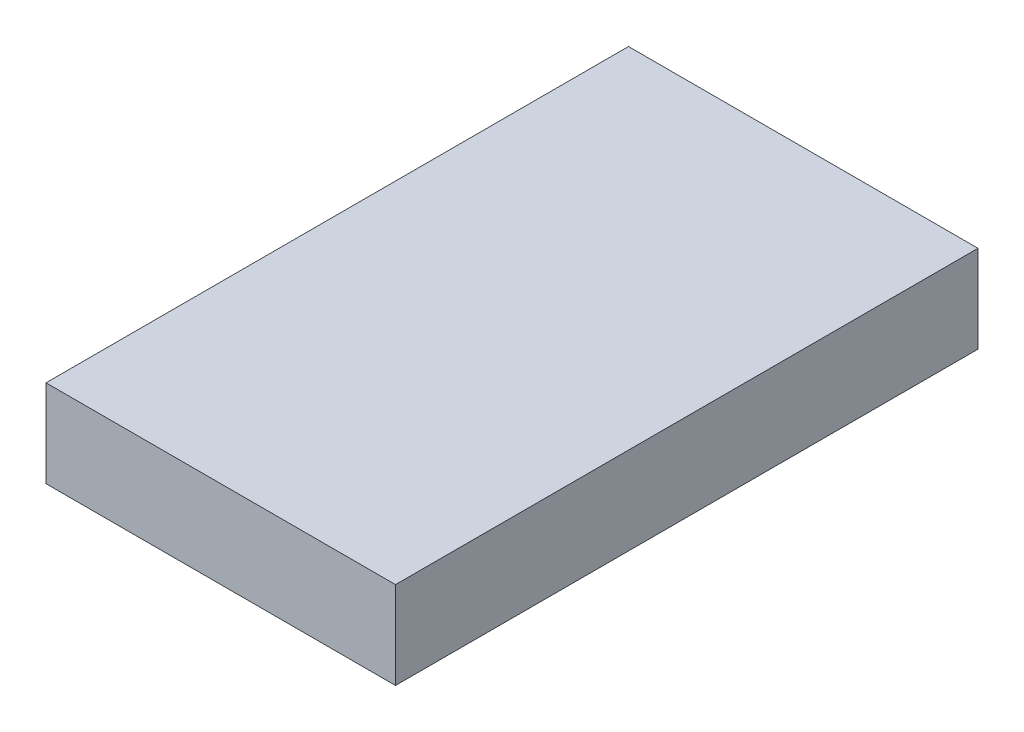
ISO-10303-21;
HEADER;
FILE_DESCRIPTION(('STEP AP214'),'2;1');
FILE_NAME('part.step','',(''),(''),'','','');
FILE_SCHEMA(('AUTOMOTIVE_DESIGN { 1 0 10303 214 1 1 1 1 }'));
ENDSEC;
DATA;
#1=APPLICATION_CONTEXT('core data for automotive mechanical design processes');
#2=APPLICATION_PROTOCOL_DEFINITION('international standard','automotive_design',2000,#1);
#3=PRODUCT_CONTEXT('',#1,'mechanical');
#4=PRODUCT('Part','Part','',(#3));
#5=PRODUCT_RELATED_PRODUCT_CATEGORY('part','',(#4));
#6=PRODUCT_DEFINITION_FORMATION('','',#4);
#7=PRODUCT_DEFINITION_CONTEXT('part definition',#1,'design');
#8=PRODUCT_DEFINITION('design','',#6,#7);
#9=PRODUCT_DEFINITION_SHAPE('','',#8);
#10=(LENGTH_UNIT() NAMED_UNIT(*) SI_UNIT(.MILLI.,.METRE.));
#11=(NAMED_UNIT(*) PLANE_ANGLE_UNIT() SI_UNIT($,.RADIAN.));
#12=(NAMED_UNIT(*) SI_UNIT($,.STERADIAN.) SOLID_ANGLE_UNIT());
#13=UNCERTAINTY_MEASURE_WITH_UNIT(LENGTH_MEASURE(1.E-05),#10,'distance_accuracy_value','');
#14=(GEOMETRIC_REPRESENTATION_CONTEXT(3) GLOBAL_UNCERTAINTY_ASSIGNED_CONTEXT((#13)) GLOBAL_UNIT_ASSIGNED_CONTEXT((#10,
#11,#12)) REPRESENTATION_CONTEXT('',''));
#15=CARTESIAN_POINT('',(0.,0.,0.));
#16=DIRECTION('',(0.,0.,1.));
#17=DIRECTION('',(1.,0.,0.));
#18=AXIS2_PLACEMENT_3D('',#15,#16,#17);
#19=CARTESIAN_POINT('',(-300.,0.,150.));
#20=DIRECTION('',(0.,0.,-1.));
#21=DIRECTION('',(0.,1.,0.));
#22=AXIS2_PLACEMENT_3D('',#19,#20,#21);
#23=PLANE('',#22);
#24=DIRECTION('',(1.,0.,0.));
#25=VECTOR('',#24,1.);
#26=CARTESIAN_POINT('',(-300.,150.,150.));
#27=LINE('',#26,#25);
#28=CARTESIAN_POINT('',(-300.,150.,150.));
#29=VERTEX_POINT('',#28);
#30=CARTESIAN_POINT('',(300.,150.,150.));
#31=VERTEX_POINT('',#30);
#32=EDGE_CURVE('E95',#29,#31,#27,.T.);
#33=ORIENTED_EDGE('',*,*,#32,.T.);
#34=DIRECTION('',(0.,1.,0.));
#35=VECTOR('',#34,1.);
#36=CARTESIAN_POINT('',(300.,0.,150.));
#37=LINE('',#36,#35);
#38=CARTESIAN_POINT('',(300.,0.,150.));
#39=VERTEX_POINT('',#38);
#40=EDGE_CURVE('E129',#39,#31,#37,.T.);
#41=ORIENTED_EDGE('',*,*,#40,.F.);
#42=DIRECTION('',(1.,0.,0.));
#43=VECTOR('',#42,1.);
#44=CARTESIAN_POINT('',(-300.,0.,150.));
#45=LINE('',#44,#43);
#46=CARTESIAN_POINT('',(-300.,0.,150.));
#47=VERTEX_POINT('',#46);
#48=EDGE_CURVE('E12',#47,#39,#45,.T.);
#49=ORIENTED_EDGE('',*,*,#48,.F.);
#50=DIRECTION('',(0.,1.,0.));
#51=VECTOR('',#50,1.);
#52=CARTESIAN_POINT('',(-300.,0.,150.));
#53=LINE('',#52,#51);
#54=EDGE_CURVE('E134',#47,#29,#53,.T.);
#55=ORIENTED_EDGE('',*,*,#54,.T.);
#56=EDGE_LOOP('',(#33,#41,#49,#55));
#57=FACE_BOUND('',#56,.T.);
#58=ADVANCED_FACE('F90',(#57),#23,.T.);
#59=CARTESIAN_POINT('',(-300.,0.,0.));
#60=DIRECTION('',(0.,1.,0.));
#61=DIRECTION('',(0.,0.,1.));
#62=AXIS2_PLACEMENT_3D('',#59,#60,#61);
#63=PLANE('',#62);
#64=ORIENTED_EDGE('',*,*,#48,.T.);
#65=DIRECTION('',(0.,0.,1.));
#66=VECTOR('',#65,1.);
#67=CARTESIAN_POINT('',(300.,0.,0.));
#68=LINE('',#67,#66);
#69=CARTESIAN_POINT('',(300.,0.,1150.));
#70=VERTEX_POINT('',#69);
#71=EDGE_CURVE('E150',#39,#70,#68,.T.);
#72=ORIENTED_EDGE('',*,*,#71,.T.);
#73=DIRECTION('',(1.,0.,0.));
#74=VECTOR('',#73,1.);
#75=CARTESIAN_POINT('',(-300.,0.,1150.));
#76=LINE('',#75,#74);
#77=CARTESIAN_POINT('',(-300.,0.,1150.));
#78=VERTEX_POINT('',#77);
#79=EDGE_CURVE('E100',#78,#70,#76,.T.);
#80=ORIENTED_EDGE('',*,*,#79,.F.);
#81=DIRECTION('',(0.,0.,1.));
#82=VECTOR('',#81,1.);
#83=CARTESIAN_POINT('',(-300.,0.,0.));
#84=LINE('',#83,#82);
#85=EDGE_CURVE('E109',#47,#78,#84,.T.);
#86=ORIENTED_EDGE('',*,*,#85,.F.);
#87=EDGE_LOOP('',(#64,#72,#80,#86));
#88=FACE_BOUND('',#87,.T.);
#89=ADVANCED_FACE('F165',(#88),#63,.F.);
#90=CARTESIAN_POINT('',(-300.,0.,1150.));
#91=DIRECTION('',(0.,0.,-1.));
#92=DIRECTION('',(-1.,0.,0.));
#93=AXIS2_PLACEMENT_3D('',#90,#91,#92);
#94=PLANE('',#93);
#95=ORIENTED_EDGE('',*,*,#79,.T.);
#96=DIRECTION('',(0.,1.,0.));
#97=VECTOR('',#96,1.);
#98=CARTESIAN_POINT('',(300.,0.,1150.));
#99=LINE('',#98,#97);
#100=CARTESIAN_POINT('',(300.,150.,1150.));
#101=VERTEX_POINT('',#100);
#102=EDGE_CURVE('E141',#70,#101,#99,.T.);
#103=ORIENTED_EDGE('',*,*,#102,.T.);
#104=DIRECTION('',(1.,0.,0.));
#105=VECTOR('',#104,1.);
#106=CARTESIAN_POINT('',(-300.,150.,1150.));
#107=LINE('',#106,#105);
#108=CARTESIAN_POINT('',(-300.,150.,1150.));
#109=VERTEX_POINT('',#108);
#110=EDGE_CURVE('E132',#109,#101,#107,.T.);
#111=ORIENTED_EDGE('',*,*,#110,.F.);
#112=DIRECTION('',(0.,1.,0.));
#113=VECTOR('',#112,1.);
#114=CARTESIAN_POINT('',(-300.,0.,1150.));
#115=LINE('',#114,#113);
#116=EDGE_CURVE('E154',#78,#109,#115,.T.);
#117=ORIENTED_EDGE('',*,*,#116,.F.);
#118=EDGE_LOOP('',(#95,#103,#111,#117));
#119=FACE_BOUND('',#118,.T.);
#120=ADVANCED_FACE('F159',(#119),#94,.F.);
#121=CARTESIAN_POINT('',(-300.,150.,0.));
#122=DIRECTION('',(0.,1.,0.));
#123=DIRECTION('',(0.,0.,1.));
#124=AXIS2_PLACEMENT_3D('',#121,#122,#123);
#125=PLANE('',#124);
#126=ORIENTED_EDGE('',*,*,#110,.T.);
#127=DIRECTION('',(0.,0.,1.));
#128=VECTOR('',#127,1.);
#129=CARTESIAN_POINT('',(300.,150.,0.));
#130=LINE('',#129,#128);
#131=EDGE_CURVE('E139',#31,#101,#130,.T.);
#132=ORIENTED_EDGE('',*,*,#131,.F.);
#133=ORIENTED_EDGE('',*,*,#32,.F.);
#134=DIRECTION('',(0.,0.,1.));
#135=VECTOR('',#134,1.);
#136=CARTESIAN_POINT('',(-300.,150.,0.));
#137=LINE('',#136,#135);
#138=EDGE_CURVE('E153',#29,#109,#137,.T.);
#139=ORIENTED_EDGE('',*,*,#138,.T.);
#140=EDGE_LOOP('',(#126,#132,#133,#139));
#141=FACE_BOUND('',#140,.T.);
#142=ADVANCED_FACE('F137',(#141),#125,.T.);
#143=CARTESIAN_POINT('',(-300.,0.,0.));
#144=DIRECTION('',(1.,0.,0.));
#145=DIRECTION('',(0.,0.,-1.));
#146=AXIS2_PLACEMENT_3D('',#143,#144,#145);
#147=PLANE('',#146);
#148=ORIENTED_EDGE('',*,*,#54,.F.);
#149=ORIENTED_EDGE('',*,*,#85,.T.);
#150=ORIENTED_EDGE('',*,*,#116,.T.);
#151=ORIENTED_EDGE('',*,*,#138,.F.);
#152=EDGE_LOOP('',(#148,#149,#150,#151));
#153=FACE_BOUND('',#152,.T.);
#154=ADVANCED_FACE('F162',(#153),#147,.F.);
#155=CARTESIAN_POINT('',(300.,0.,0.));
#156=DIRECTION('',(1.,0.,0.));
#157=DIRECTION('',(0.,0.,-1.));
#158=AXIS2_PLACEMENT_3D('',#155,#156,#157);
#159=PLANE('',#158);
#160=ORIENTED_EDGE('',*,*,#40,.T.);
#161=ORIENTED_EDGE('',*,*,#131,.T.);
#162=ORIENTED_EDGE('',*,*,#102,.F.);
#163=ORIENTED_EDGE('',*,*,#71,.F.);
#164=EDGE_LOOP('',(#160,#161,#162,#163));
#165=FACE_BOUND('',#164,.T.);
#166=ADVANCED_FACE('F144',(#165),#159,.T.);
#167=CLOSED_SHELL('',(#58,#89,#120,#142,#154,#166));
#168=MANIFOLD_SOLID_BREP('B2',#167);
#169=ADVANCED_BREP_SHAPE_REPRESENTATION('',(#18,#168),#14);
#170=SHAPE_DEFINITION_REPRESENTATION(#9,#169);
ENDSEC;
END-ISO-10303-21;
